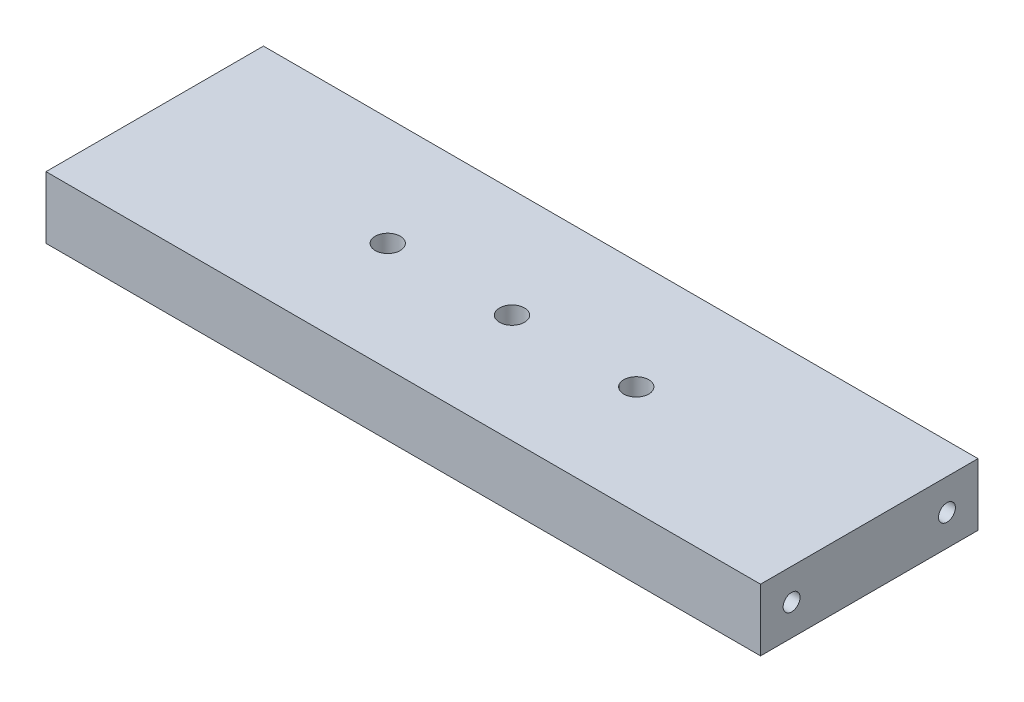
ISO-10303-21;
HEADER;
FILE_DESCRIPTION(('STEP AP214'),'2;1');
FILE_NAME('part.step','',(''),(''),'','','');
FILE_SCHEMA(('AUTOMOTIVE_DESIGN { 1 0 10303 214 1 1 1 1 }'));
ENDSEC;
DATA;
#1=APPLICATION_CONTEXT('core data for automotive mechanical design processes');
#2=APPLICATION_PROTOCOL_DEFINITION('international standard','automotive_design',2000,#1);
#3=PRODUCT_CONTEXT('',#1,'mechanical');
#4=PRODUCT('Part','Part','',(#3));
#5=PRODUCT_RELATED_PRODUCT_CATEGORY('part','',(#4));
#6=PRODUCT_DEFINITION_FORMATION('','',#4);
#7=PRODUCT_DEFINITION_CONTEXT('part definition',#1,'design');
#8=PRODUCT_DEFINITION('design','',#6,#7);
#9=PRODUCT_DEFINITION_SHAPE('','',#8);
#10=(LENGTH_UNIT() NAMED_UNIT(*) SI_UNIT(.MILLI.,.METRE.));
#11=(NAMED_UNIT(*) PLANE_ANGLE_UNIT() SI_UNIT($,.RADIAN.));
#12=(NAMED_UNIT(*) SI_UNIT($,.STERADIAN.) SOLID_ANGLE_UNIT());
#13=UNCERTAINTY_MEASURE_WITH_UNIT(LENGTH_MEASURE(1.E-05),#10,'distance_accuracy_value','');
#14=(GEOMETRIC_REPRESENTATION_CONTEXT(3) GLOBAL_UNCERTAINTY_ASSIGNED_CONTEXT((#13)) GLOBAL_UNIT_ASSIGNED_CONTEXT((#10,
#11,#12)) REPRESENTATION_CONTEXT('',''));
#15=CARTESIAN_POINT('',(0.,0.,0.));
#16=DIRECTION('',(0.,0.,1.));
#17=DIRECTION('',(1.,0.,0.));
#18=AXIS2_PLACEMENT_3D('',#15,#16,#17);
#19=CARTESIAN_POINT('',(73.025,12.7,22.225));
#20=DIRECTION('',(-1.,0.,0.));
#21=DIRECTION('',(0.,0.,1.));
#22=AXIS2_PLACEMENT_3D('',#19,#20,#21);
#23=PLANE('',#22);
#24=CARTESIAN_POINT('',(73.025,6.35,-15.875));
#25=DIRECTION('',(1.,0.,0.));
#26=DIRECTION('',(0.,0.,-1.));
#27=AXIS2_PLACEMENT_3D('',#24,#25,#26);
#28=CIRCLE('',#27,1.72719999999999);
#29=CARTESIAN_POINT('',(73.025,6.35,-17.6022));
#30=VERTEX_POINT('',#29);
#31=EDGE_CURVE('E106',#30,#30,#28,.T.);
#32=ORIENTED_EDGE('',*,*,#31,.F.);
#33=EDGE_LOOP('',(#32));
#34=FACE_BOUND('',#33,.T.);
#35=CARTESIAN_POINT('',(73.025,6.35,15.875));
#36=DIRECTION('',(1.,0.,0.));
#37=DIRECTION('',(0.,0.,-1.));
#38=AXIS2_PLACEMENT_3D('',#35,#36,#37);
#39=CIRCLE('',#38,1.72719999999999);
#40=CARTESIAN_POINT('',(73.025,6.35,14.1478));
#41=VERTEX_POINT('',#40);
#42=EDGE_CURVE('E105',#41,#41,#39,.T.);
#43=ORIENTED_EDGE('',*,*,#42,.F.);
#44=EDGE_LOOP('',(#43));
#45=FACE_BOUND('',#44,.T.);
#46=DIRECTION('',(0.,0.,-1.));
#47=VECTOR('',#46,1.);
#48=CARTESIAN_POINT('',(73.025,0.,22.225));
#49=LINE('',#48,#47);
#50=CARTESIAN_POINT('',(73.025,0.,22.225));
#51=VERTEX_POINT('',#50);
#52=CARTESIAN_POINT('',(73.025,0.,-22.225));
#53=VERTEX_POINT('',#52);
#54=EDGE_CURVE('E146',#51,#53,#49,.T.);
#55=ORIENTED_EDGE('',*,*,#54,.T.);
#56=DIRECTION('',(0.,-1.,0.));
#57=VECTOR('',#56,1.);
#58=CARTESIAN_POINT('',(73.025,12.7,-22.225));
#59=LINE('',#58,#57);
#60=CARTESIAN_POINT('',(73.025,12.7,-22.225));
#61=VERTEX_POINT('',#60);
#62=EDGE_CURVE('E11',#61,#53,#59,.T.);
#63=ORIENTED_EDGE('',*,*,#62,.F.);
#64=DIRECTION('',(0.,0.,-1.));
#65=VECTOR('',#64,1.);
#66=CARTESIAN_POINT('',(73.025,12.7,22.225));
#67=LINE('',#66,#65);
#68=CARTESIAN_POINT('',(73.025,12.7,22.225));
#69=VERTEX_POINT('',#68);
#70=EDGE_CURVE('E147',#69,#61,#67,.T.);
#71=ORIENTED_EDGE('',*,*,#70,.F.);
#72=DIRECTION('',(0.,-1.,0.));
#73=VECTOR('',#72,1.);
#74=CARTESIAN_POINT('',(73.025,12.7,22.225));
#75=LINE('',#74,#73);
#76=EDGE_CURVE('E153',#69,#51,#75,.T.);
#77=ORIENTED_EDGE('',*,*,#76,.T.);
#78=EDGE_LOOP('',(#55,#63,#71,#77));
#79=FACE_BOUND('',#78,.T.);
#80=ADVANCED_FACE('F35',(#34,#45,#79),#23,.F.);
#81=CARTESIAN_POINT('',(-73.025,12.7,-22.225));
#82=DIRECTION('',(0.,0.,1.));
#83=DIRECTION('',(1.,0.,0.));
#84=AXIS2_PLACEMENT_3D('',#81,#82,#83);
#85=PLANE('',#84);
#86=DIRECTION('',(-1.,0.,0.));
#87=VECTOR('',#86,1.);
#88=CARTESIAN_POINT('',(-73.025,0.,-22.225));
#89=LINE('',#88,#87);
#90=CARTESIAN_POINT('',(-73.025,0.,-22.225));
#91=VERTEX_POINT('',#90);
#92=EDGE_CURVE('E156',#53,#91,#89,.T.);
#93=ORIENTED_EDGE('',*,*,#92,.T.);
#94=DIRECTION('',(0.,-1.,0.));
#95=VECTOR('',#94,1.);
#96=CARTESIAN_POINT('',(-73.025,12.7,-22.225));
#97=LINE('',#96,#95);
#98=CARTESIAN_POINT('',(-73.025,12.7,-22.225));
#99=VERTEX_POINT('',#98);
#100=EDGE_CURVE('E43',#99,#91,#97,.T.);
#101=ORIENTED_EDGE('',*,*,#100,.F.);
#102=DIRECTION('',(-1.,0.,0.));
#103=VECTOR('',#102,1.);
#104=CARTESIAN_POINT('',(-73.025,12.7,-22.225));
#105=LINE('',#104,#103);
#106=EDGE_CURVE('E82',#61,#99,#105,.T.);
#107=ORIENTED_EDGE('',*,*,#106,.F.);
#108=ORIENTED_EDGE('',*,*,#62,.T.);
#109=EDGE_LOOP('',(#93,#101,#107,#108));
#110=FACE_BOUND('',#109,.T.);
#111=ADVANCED_FACE('F180',(#110),#85,.F.);
#112=CARTESIAN_POINT('',(-73.025,12.7,22.225));
#113=DIRECTION('',(1.,0.,0.));
#114=DIRECTION('',(0.,0.,-1.));
#115=AXIS2_PLACEMENT_3D('',#112,#113,#114);
#116=PLANE('',#115);
#117=CARTESIAN_POINT('',(-73.025,6.35,-15.875));
#118=DIRECTION('',(-1.,0.,0.));
#119=DIRECTION('',(0.,0.,1.));
#120=AXIS2_PLACEMENT_3D('',#117,#118,#119);
#121=CIRCLE('',#120,1.72719999999999);
#122=CARTESIAN_POINT('',(-73.025,6.35,-14.1478));
#123=VERTEX_POINT('',#122);
#124=EDGE_CURVE('E116',#123,#123,#121,.T.);
#125=ORIENTED_EDGE('',*,*,#124,.F.);
#126=EDGE_LOOP('',(#125));
#127=FACE_BOUND('',#126,.T.);
#128=CARTESIAN_POINT('',(-73.025,6.35,15.875));
#129=DIRECTION('',(-1.,0.,0.));
#130=DIRECTION('',(0.,0.,1.));
#131=AXIS2_PLACEMENT_3D('',#128,#129,#130);
#132=CIRCLE('',#131,1.72719999999999);
#133=CARTESIAN_POINT('',(-73.025,6.35,17.6022));
#134=VERTEX_POINT('',#133);
#135=EDGE_CURVE('E122',#134,#134,#132,.T.);
#136=ORIENTED_EDGE('',*,*,#135,.F.);
#137=EDGE_LOOP('',(#136));
#138=FACE_BOUND('',#137,.T.);
#139=DIRECTION('',(0.,0.,1.));
#140=VECTOR('',#139,1.);
#141=CARTESIAN_POINT('',(-73.025,0.,22.225));
#142=LINE('',#141,#140);
#143=CARTESIAN_POINT('',(-73.025,0.,22.225));
#144=VERTEX_POINT('',#143);
#145=EDGE_CURVE('E69',#91,#144,#142,.T.);
#146=ORIENTED_EDGE('',*,*,#145,.T.);
#147=DIRECTION('',(0.,-1.,0.));
#148=VECTOR('',#147,1.);
#149=CARTESIAN_POINT('',(-73.025,12.7,22.225));
#150=LINE('',#149,#148);
#151=CARTESIAN_POINT('',(-73.025,12.7,22.225));
#152=VERTEX_POINT('',#151);
#153=EDGE_CURVE('E161',#152,#144,#150,.T.);
#154=ORIENTED_EDGE('',*,*,#153,.F.);
#155=DIRECTION('',(0.,0.,1.));
#156=VECTOR('',#155,1.);
#157=CARTESIAN_POINT('',(-73.025,12.7,22.225));
#158=LINE('',#157,#156);
#159=EDGE_CURVE('E150',#99,#152,#158,.T.);
#160=ORIENTED_EDGE('',*,*,#159,.F.);
#161=ORIENTED_EDGE('',*,*,#100,.T.);
#162=EDGE_LOOP('',(#146,#154,#160,#161));
#163=FACE_BOUND('',#162,.T.);
#164=ADVANCED_FACE('F163',(#127,#138,#163),#116,.F.);
#165=CARTESIAN_POINT('',(-73.025,12.7,22.225));
#166=DIRECTION('',(0.,0.,-1.));
#167=DIRECTION('',(-1.,0.,0.));
#168=AXIS2_PLACEMENT_3D('',#165,#166,#167);
#169=PLANE('',#168);
#170=DIRECTION('',(1.,0.,0.));
#171=VECTOR('',#170,1.);
#172=CARTESIAN_POINT('',(-73.025,0.,22.225));
#173=LINE('',#172,#171);
#174=EDGE_CURVE('E75',#144,#51,#173,.T.);
#175=ORIENTED_EDGE('',*,*,#174,.T.);
#176=ORIENTED_EDGE('',*,*,#76,.F.);
#177=DIRECTION('',(1.,0.,0.));
#178=VECTOR('',#177,1.);
#179=CARTESIAN_POINT('',(-73.025,12.7,22.225));
#180=LINE('',#179,#178);
#181=EDGE_CURVE('E51',#152,#69,#180,.T.);
#182=ORIENTED_EDGE('',*,*,#181,.F.);
#183=ORIENTED_EDGE('',*,*,#153,.T.);
#184=EDGE_LOOP('',(#175,#176,#182,#183));
#185=FACE_BOUND('',#184,.T.);
#186=ADVANCED_FACE('F170',(#185),#169,.F.);
#187=CARTESIAN_POINT('',(0.,12.7,0.));
#188=DIRECTION('',(0.,-1.,0.));
#189=DIRECTION('',(0.,0.,-1.));
#190=AXIS2_PLACEMENT_3D('',#187,#188,#189);
#191=PLANE('',#190);
#192=CARTESIAN_POINT('',(0.,12.7,0.));
#193=DIRECTION('',(0.,-1.,0.));
#194=DIRECTION('',(0.,0.,-1.));
#195=AXIS2_PLACEMENT_3D('',#192,#193,#194);
#196=CIRCLE('',#195,2.5527);
#197=CARTESIAN_POINT('',(0.,12.7,-2.5527));
#198=VERTEX_POINT('',#197);
#199=EDGE_CURVE('E131',#198,#198,#196,.T.);
#200=ORIENTED_EDGE('',*,*,#199,.T.);
#201=EDGE_LOOP('',(#200));
#202=FACE_BOUND('',#201,.T.);
#203=CARTESIAN_POINT('',(25.4,12.7,0.));
#204=DIRECTION('',(0.,-1.,0.));
#205=DIRECTION('',(0.,0.,-1.));
#206=AXIS2_PLACEMENT_3D('',#203,#204,#205);
#207=CIRCLE('',#206,2.5527);
#208=CARTESIAN_POINT('',(25.4,12.7,-2.5527));
#209=VERTEX_POINT('',#208);
#210=EDGE_CURVE('E137',#209,#209,#207,.T.);
#211=ORIENTED_EDGE('',*,*,#210,.T.);
#212=EDGE_LOOP('',(#211));
#213=FACE_BOUND('',#212,.T.);
#214=CARTESIAN_POINT('',(-25.4,12.7,0.));
#215=DIRECTION('',(0.,-1.,0.));
#216=DIRECTION('',(0.,0.,-1.));
#217=AXIS2_PLACEMENT_3D('',#214,#215,#216);
#218=CIRCLE('',#217,2.5527);
#219=CARTESIAN_POINT('',(-25.4,12.7,-2.5527));
#220=VERTEX_POINT('',#219);
#221=EDGE_CURVE('E143',#220,#220,#218,.T.);
#222=ORIENTED_EDGE('',*,*,#221,.T.);
#223=EDGE_LOOP('',(#222));
#224=FACE_BOUND('',#223,.T.);
#225=ORIENTED_EDGE('',*,*,#70,.T.);
#226=ORIENTED_EDGE('',*,*,#106,.T.);
#227=ORIENTED_EDGE('',*,*,#159,.T.);
#228=ORIENTED_EDGE('',*,*,#181,.T.);
#229=EDGE_LOOP('',(#225,#226,#227,#228));
#230=FACE_BOUND('',#229,.T.);
#231=ADVANCED_FACE('F172',(#202,#213,#224,#230),#191,.F.);
#232=CARTESIAN_POINT('',(0.,0.,0.));
#233=DIRECTION('',(0.,-1.,0.));
#234=DIRECTION('',(0.,0.,-1.));
#235=AXIS2_PLACEMENT_3D('',#232,#233,#234);
#236=PLANE('',#235);
#237=CARTESIAN_POINT('',(0.,0.,0.));
#238=DIRECTION('',(0.,-1.,0.));
#239=DIRECTION('',(0.,0.,-1.));
#240=AXIS2_PLACEMENT_3D('',#237,#238,#239);
#241=CIRCLE('',#240,2.5527);
#242=CARTESIAN_POINT('',(0.,0.,-2.5527));
#243=VERTEX_POINT('',#242);
#244=EDGE_CURVE('E128',#243,#243,#241,.T.);
#245=ORIENTED_EDGE('',*,*,#244,.F.);
#246=EDGE_LOOP('',(#245));
#247=FACE_BOUND('',#246,.T.);
#248=CARTESIAN_POINT('',(25.4,0.,0.));
#249=DIRECTION('',(0.,-1.,0.));
#250=DIRECTION('',(0.,0.,-1.));
#251=AXIS2_PLACEMENT_3D('',#248,#249,#250);
#252=CIRCLE('',#251,2.5527);
#253=CARTESIAN_POINT('',(25.4,0.,-2.5527));
#254=VERTEX_POINT('',#253);
#255=EDGE_CURVE('E134',#254,#254,#252,.T.);
#256=ORIENTED_EDGE('',*,*,#255,.F.);
#257=EDGE_LOOP('',(#256));
#258=FACE_BOUND('',#257,.T.);
#259=CARTESIAN_POINT('',(-25.4,0.,0.));
#260=DIRECTION('',(0.,-1.,0.));
#261=DIRECTION('',(0.,0.,-1.));
#262=AXIS2_PLACEMENT_3D('',#259,#260,#261);
#263=CIRCLE('',#262,2.5527);
#264=CARTESIAN_POINT('',(-25.4,0.,-2.5527));
#265=VERTEX_POINT('',#264);
#266=EDGE_CURVE('E140',#265,#265,#263,.T.);
#267=ORIENTED_EDGE('',*,*,#266,.F.);
#268=EDGE_LOOP('',(#267));
#269=FACE_BOUND('',#268,.T.);
#270=ORIENTED_EDGE('',*,*,#54,.F.);
#271=ORIENTED_EDGE('',*,*,#174,.F.);
#272=ORIENTED_EDGE('',*,*,#145,.F.);
#273=ORIENTED_EDGE('',*,*,#92,.F.);
#274=EDGE_LOOP('',(#270,#271,#272,#273));
#275=FACE_BOUND('',#274,.T.);
#276=ADVANCED_FACE('F166',(#247,#258,#269,#275),#236,.T.);
#277=CARTESIAN_POINT('',(-25.4,0.,0.));
#278=DIRECTION('',(0.,-1.,0.));
#279=DIRECTION('',(0.,0.,-1.));
#280=AXIS2_PLACEMENT_3D('',#277,#278,#279);
#281=CYLINDRICAL_SURFACE('',#280,2.5527);
#282=ORIENTED_EDGE('',*,*,#221,.F.);
#283=EDGE_LOOP('',(#282));
#284=FACE_BOUND('',#283,.T.);
#285=ORIENTED_EDGE('',*,*,#266,.T.);
#286=EDGE_LOOP('',(#285));
#287=FACE_BOUND('',#286,.T.);
#288=ADVANCED_FACE('F228',(#284,#287),#281,.F.);
#289=CARTESIAN_POINT('',(25.4,0.,0.));
#290=DIRECTION('',(0.,-1.,0.));
#291=DIRECTION('',(0.,0.,-1.));
#292=AXIS2_PLACEMENT_3D('',#289,#290,#291);
#293=CYLINDRICAL_SURFACE('',#292,2.5527);
#294=ORIENTED_EDGE('',*,*,#210,.F.);
#295=EDGE_LOOP('',(#294));
#296=FACE_BOUND('',#295,.T.);
#297=ORIENTED_EDGE('',*,*,#255,.T.);
#298=EDGE_LOOP('',(#297));
#299=FACE_BOUND('',#298,.T.);
#300=ADVANCED_FACE('F224',(#296,#299),#293,.F.);
#301=CARTESIAN_POINT('',(0.,0.,0.));
#302=DIRECTION('',(0.,-1.,0.));
#303=DIRECTION('',(0.,0.,-1.));
#304=AXIS2_PLACEMENT_3D('',#301,#302,#303);
#305=CYLINDRICAL_SURFACE('',#304,2.5527);
#306=ORIENTED_EDGE('',*,*,#199,.F.);
#307=EDGE_LOOP('',(#306));
#308=FACE_BOUND('',#307,.T.);
#309=ORIENTED_EDGE('',*,*,#244,.T.);
#310=EDGE_LOOP('',(#309));
#311=FACE_BOUND('',#310,.T.);
#312=ADVANCED_FACE('F220',(#308,#311),#305,.F.);
#313=CARTESIAN_POINT('',(-66.675,6.35,15.875));
#314=DIRECTION('',(-1.,0.,0.));
#315=DIRECTION('',(0.,0.,1.));
#316=AXIS2_PLACEMENT_3D('',#313,#314,#315);
#317=CONICAL_SURFACE('',#316,1.7272,1.02974425867665);
#318=CARTESIAN_POINT('',(-65.6371935388156,6.35,15.875));
#319=VERTEX_POINT('',#318);
#320=VERTEX_LOOP('',#319);
#321=FACE_BOUND('',#320,.T.);
#322=CARTESIAN_POINT('',(-66.675,6.35,15.875));
#323=DIRECTION('',(-1.,0.,0.));
#324=DIRECTION('',(0.,0.,1.));
#325=AXIS2_PLACEMENT_3D('',#322,#323,#324);
#326=CIRCLE('',#325,1.7272);
#327=CARTESIAN_POINT('',(-66.675,6.35,17.6022));
#328=VERTEX_POINT('',#327);
#329=EDGE_CURVE('E125',#328,#328,#326,.T.);
#330=ORIENTED_EDGE('',*,*,#329,.T.);
#331=EDGE_LOOP('',(#330));
#332=FACE_BOUND('',#331,.T.);
#333=ADVANCED_FACE('F216',(#321,#332),#317,.F.);
#334=CARTESIAN_POINT('',(-73.025,6.35,15.875));
#335=DIRECTION('',(-1.,0.,0.));
#336=DIRECTION('',(0.,0.,1.));
#337=AXIS2_PLACEMENT_3D('',#334,#335,#336);
#338=CYLINDRICAL_SURFACE('',#337,1.72719999999999);
#339=ORIENTED_EDGE('',*,*,#329,.F.);
#340=EDGE_LOOP('',(#339));
#341=FACE_BOUND('',#340,.T.);
#342=ORIENTED_EDGE('',*,*,#135,.T.);
#343=EDGE_LOOP('',(#342));
#344=FACE_BOUND('',#343,.T.);
#345=ADVANCED_FACE('F212',(#341,#344),#338,.F.);
#346=CARTESIAN_POINT('',(-66.675,6.35,-15.875));
#347=DIRECTION('',(-1.,0.,0.));
#348=DIRECTION('',(0.,0.,1.));
#349=AXIS2_PLACEMENT_3D('',#346,#347,#348);
#350=CONICAL_SURFACE('',#349,1.7272,1.02974425867665);
#351=CARTESIAN_POINT('',(-65.6371935388156,6.35,-15.875));
#352=VERTEX_POINT('',#351);
#353=VERTEX_LOOP('',#352);
#354=FACE_BOUND('',#353,.T.);
#355=CARTESIAN_POINT('',(-66.675,6.35,-15.875));
#356=DIRECTION('',(-1.,0.,0.));
#357=DIRECTION('',(0.,0.,1.));
#358=AXIS2_PLACEMENT_3D('',#355,#356,#357);
#359=CIRCLE('',#358,1.7272);
#360=CARTESIAN_POINT('',(-66.675,6.35,-14.1478));
#361=VERTEX_POINT('',#360);
#362=EDGE_CURVE('E119',#361,#361,#359,.T.);
#363=ORIENTED_EDGE('',*,*,#362,.T.);
#364=EDGE_LOOP('',(#363));
#365=FACE_BOUND('',#364,.T.);
#366=ADVANCED_FACE('F208',(#354,#365),#350,.F.);
#367=CARTESIAN_POINT('',(-73.025,6.35,-15.875));
#368=DIRECTION('',(-1.,0.,0.));
#369=DIRECTION('',(0.,0.,1.));
#370=AXIS2_PLACEMENT_3D('',#367,#368,#369);
#371=CYLINDRICAL_SURFACE('',#370,1.72719999999999);
#372=ORIENTED_EDGE('',*,*,#362,.F.);
#373=EDGE_LOOP('',(#372));
#374=FACE_BOUND('',#373,.T.);
#375=ORIENTED_EDGE('',*,*,#124,.T.);
#376=EDGE_LOOP('',(#375));
#377=FACE_BOUND('',#376,.T.);
#378=ADVANCED_FACE('F200',(#374,#377),#371,.F.);
#379=CARTESIAN_POINT('',(66.675,6.35,15.875));
#380=DIRECTION('',(1.,0.,0.));
#381=DIRECTION('',(0.,0.,-1.));
#382=AXIS2_PLACEMENT_3D('',#379,#380,#381);
#383=CONICAL_SURFACE('',#382,1.7272,1.02974425867665);
#384=CARTESIAN_POINT('',(65.6371935388156,6.35,15.875));
#385=VERTEX_POINT('',#384);
#386=VERTEX_LOOP('',#385);
#387=FACE_BOUND('',#386,.T.);
#388=CARTESIAN_POINT('',(66.675,6.35,15.875));
#389=DIRECTION('',(1.,0.,0.));
#390=DIRECTION('',(0.,0.,-1.));
#391=AXIS2_PLACEMENT_3D('',#388,#389,#390);
#392=CIRCLE('',#391,1.7272);
#393=CARTESIAN_POINT('',(66.675,6.35,14.1478));
#394=VERTEX_POINT('',#393);
#395=EDGE_CURVE('E109',#394,#394,#392,.T.);
#396=ORIENTED_EDGE('',*,*,#395,.T.);
#397=EDGE_LOOP('',(#396));
#398=FACE_BOUND('',#397,.T.);
#399=ADVANCED_FACE('F194',(#387,#398),#383,.F.);
#400=CARTESIAN_POINT('',(73.025,6.35,15.875));
#401=DIRECTION('',(1.,0.,0.));
#402=DIRECTION('',(0.,0.,-1.));
#403=AXIS2_PLACEMENT_3D('',#400,#401,#402);
#404=CYLINDRICAL_SURFACE('',#403,1.72719999999999);
#405=ORIENTED_EDGE('',*,*,#395,.F.);
#406=EDGE_LOOP('',(#405));
#407=FACE_BOUND('',#406,.T.);
#408=ORIENTED_EDGE('',*,*,#42,.T.);
#409=EDGE_LOOP('',(#408));
#410=FACE_BOUND('',#409,.T.);
#411=ADVANCED_FACE('F99',(#407,#410),#404,.F.);
#412=CARTESIAN_POINT('',(66.675,6.35,-15.875));
#413=DIRECTION('',(1.,0.,0.));
#414=DIRECTION('',(0.,0.,-1.));
#415=AXIS2_PLACEMENT_3D('',#412,#413,#414);
#416=CONICAL_SURFACE('',#415,1.7272,1.02974425867665);
#417=CARTESIAN_POINT('',(65.6371935388156,6.35,-15.875));
#418=VERTEX_POINT('',#417);
#419=VERTEX_LOOP('',#418);
#420=FACE_BOUND('',#419,.T.);
#421=CARTESIAN_POINT('',(66.675,6.35,-15.875));
#422=DIRECTION('',(1.,0.,0.));
#423=DIRECTION('',(0.,0.,-1.));
#424=AXIS2_PLACEMENT_3D('',#421,#422,#423);
#425=CIRCLE('',#424,1.7272);
#426=CARTESIAN_POINT('',(66.675,6.35,-17.6022));
#427=VERTEX_POINT('',#426);
#428=EDGE_CURVE('E103',#427,#427,#425,.T.);
#429=ORIENTED_EDGE('',*,*,#428,.T.);
#430=EDGE_LOOP('',(#429));
#431=FACE_BOUND('',#430,.T.);
#432=ADVANCED_FACE('F95',(#420,#431),#416,.F.);
#433=CARTESIAN_POINT('',(73.025,6.35,-15.875));
#434=DIRECTION('',(1.,0.,0.));
#435=DIRECTION('',(0.,0.,-1.));
#436=AXIS2_PLACEMENT_3D('',#433,#434,#435);
#437=CYLINDRICAL_SURFACE('',#436,1.72719999999999);
#438=ORIENTED_EDGE('',*,*,#428,.F.);
#439=EDGE_LOOP('',(#438));
#440=FACE_BOUND('',#439,.T.);
#441=ORIENTED_EDGE('',*,*,#31,.T.);
#442=EDGE_LOOP('',(#441));
#443=FACE_BOUND('',#442,.T.);
#444=ADVANCED_FACE('F98',(#440,#443),#437,.F.);
#445=CLOSED_SHELL('',(#80,#111,#164,#186,#231,#276,#288,#300,#312,#333,#345,#366,#378,#399,#411,
#432,#444));
#446=MANIFOLD_SOLID_BREP('B2',#445);
#447=ADVANCED_BREP_SHAPE_REPRESENTATION('',(#18,#446),#14);
#448=SHAPE_DEFINITION_REPRESENTATION(#9,#447);
ENDSEC;
END-ISO-10303-21;
